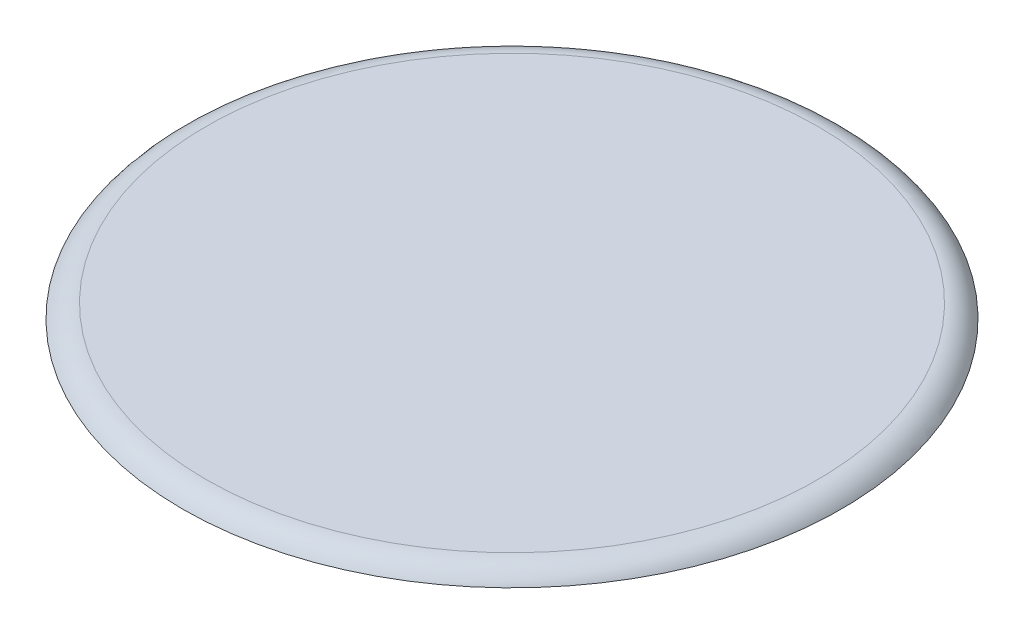
ISO-10303-21;
HEADER;
FILE_DESCRIPTION(('STEP AP214'),'2;1');
FILE_NAME('part.step','',(''),(''),'','','');
FILE_SCHEMA(('AUTOMOTIVE_DESIGN { 1 0 10303 214 1 1 1 1 }'));
ENDSEC;
DATA;
#1=APPLICATION_CONTEXT('core data for automotive mechanical design processes');
#2=APPLICATION_PROTOCOL_DEFINITION('international standard','automotive_design',2000,#1);
#3=PRODUCT_CONTEXT('',#1,'mechanical');
#4=PRODUCT('Part','Part','',(#3));
#5=PRODUCT_RELATED_PRODUCT_CATEGORY('part','',(#4));
#6=PRODUCT_DEFINITION_FORMATION('','',#4);
#7=PRODUCT_DEFINITION_CONTEXT('part definition',#1,'design');
#8=PRODUCT_DEFINITION('design','',#6,#7);
#9=PRODUCT_DEFINITION_SHAPE('','',#8);
#10=(LENGTH_UNIT() NAMED_UNIT(*) SI_UNIT(.MILLI.,.METRE.));
#11=(NAMED_UNIT(*) PLANE_ANGLE_UNIT() SI_UNIT($,.RADIAN.));
#12=(NAMED_UNIT(*) SI_UNIT($,.STERADIAN.) SOLID_ANGLE_UNIT());
#13=UNCERTAINTY_MEASURE_WITH_UNIT(LENGTH_MEASURE(1.E-05),#10,'distance_accuracy_value','');
#14=(GEOMETRIC_REPRESENTATION_CONTEXT(3) GLOBAL_UNCERTAINTY_ASSIGNED_CONTEXT((#13)) GLOBAL_UNIT_ASSIGNED_CONTEXT((#10,
#11,#12)) REPRESENTATION_CONTEXT('',''));
#15=CARTESIAN_POINT('',(0.,0.,0.));
#16=DIRECTION('',(0.,0.,1.));
#17=DIRECTION('',(1.,0.,0.));
#18=AXIS2_PLACEMENT_3D('',#15,#16,#17);
#19=CARTESIAN_POINT('',(0.,2.54,0.));
#20=DIRECTION('',(0.,1.,0.));
#21=DIRECTION('',(0.,0.,1.));
#22=AXIS2_PLACEMENT_3D('',#19,#20,#21);
#23=PLANE('',#22);
#24=CARTESIAN_POINT('',(0.,2.54,0.));
#25=DIRECTION('',(0.,1.,0.));
#26=DIRECTION('',(0.,0.,1.));
#27=AXIS2_PLACEMENT_3D('',#24,#25,#26);
#28=CIRCLE('',#27,56.8145909487751);
#29=CARTESIAN_POINT('',(0.,2.54,56.8145909487751));
#30=VERTEX_POINT('',#29);
#31=EDGE_CURVE('E10',#30,#30,#28,.T.);
#32=ORIENTED_EDGE('',*,*,#31,.T.);
#33=EDGE_LOOP('',(#32));
#34=FACE_BOUND('',#33,.T.);
#35=ADVANCED_FACE('F30',(#34),#23,.T.);
#36=CARTESIAN_POINT('',(0.,0.,0.));
#37=DIRECTION('',(0.,1.,0.));
#38=DIRECTION('',(0.,0.,1.));
#39=AXIS2_PLACEMENT_3D('',#36,#37,#38);
#40=PLANE('',#39);
#41=CARTESIAN_POINT('',(0.,0.,0.));
#42=DIRECTION('',(0.,1.,0.));
#43=DIRECTION('',(0.,0.,1.));
#44=AXIS2_PLACEMENT_3D('',#41,#42,#43);
#45=CIRCLE('',#44,61.214);
#46=CARTESIAN_POINT('',(0.,0.,61.214));
#47=VERTEX_POINT('',#46);
#48=EDGE_CURVE('E37',#47,#47,#45,.T.);
#49=ORIENTED_EDGE('',*,*,#48,.F.);
#50=EDGE_LOOP('',(#49));
#51=FACE_BOUND('',#50,.T.);
#52=ADVANCED_FACE('F45',(#51),#40,.F.);
#53=CARTESIAN_POINT('',(0.,-2.54,0.));
#54=DIRECTION('',(0.,-1.,0.));
#55=DIRECTION('',(0.,0.,-1.));
#56=AXIS2_PLACEMENT_3D('',#53,#54,#55);
#57=TOROIDAL_SURFACE('',#56,56.8145909487751,5.08);
#58=ORIENTED_EDGE('',*,*,#48,.T.);
#59=EDGE_LOOP('',(#58));
#60=FACE_BOUND('',#59,.T.);
#61=ORIENTED_EDGE('',*,*,#31,.F.);
#62=EDGE_LOOP('',(#61));
#63=FACE_BOUND('',#62,.T.);
#64=ADVANCED_FACE('F32',(#60,#63),#57,.T.);
#65=CLOSED_SHELL('',(#35,#52,#64));
#66=MANIFOLD_SOLID_BREP('B2',#65);
#67=ADVANCED_BREP_SHAPE_REPRESENTATION('',(#18,#66),#14);
#68=SHAPE_DEFINITION_REPRESENTATION(#9,#67);
ENDSEC;
END-ISO-10303-21;
